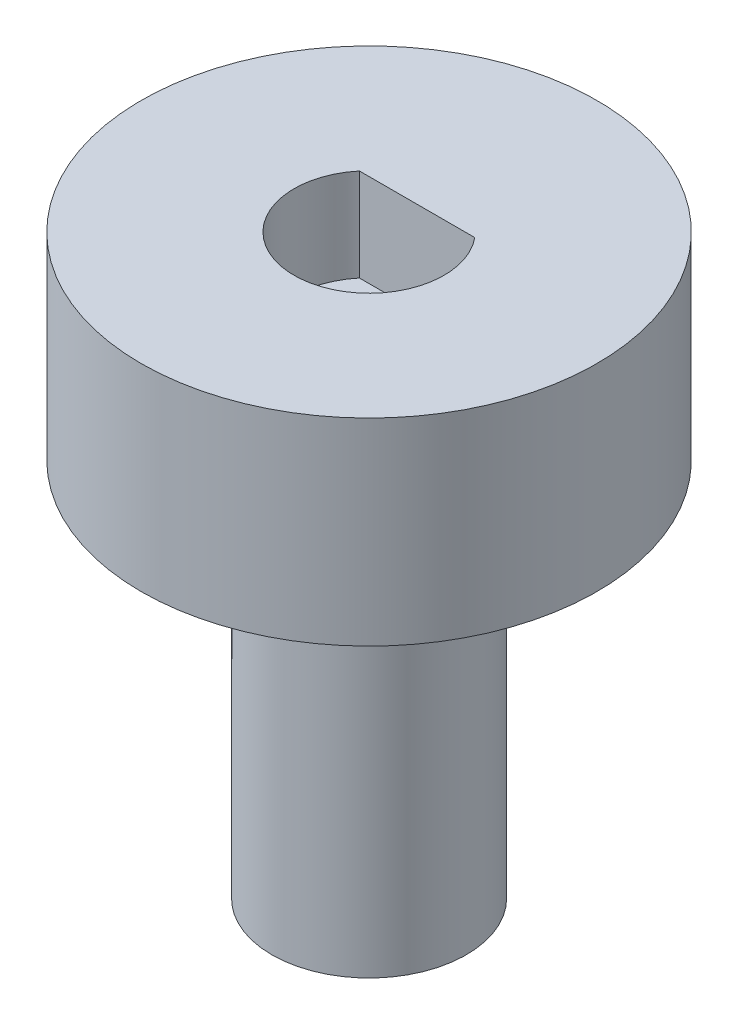
ISO-10303-21;
HEADER;
FILE_DESCRIPTION(('STEP AP214'),'2;1');
FILE_NAME('part.step','',(''),(''),'','','');
FILE_SCHEMA(('AUTOMOTIVE_DESIGN { 1 0 10303 214 1 1 1 1 }'));
ENDSEC;
DATA;
#1=APPLICATION_CONTEXT('core data for automotive mechanical design processes');
#2=APPLICATION_PROTOCOL_DEFINITION('international standard','automotive_design',2000,#1);
#3=PRODUCT_CONTEXT('',#1,'mechanical');
#4=PRODUCT('Part','Part','',(#3));
#5=PRODUCT_RELATED_PRODUCT_CATEGORY('part','',(#4));
#6=PRODUCT_DEFINITION_FORMATION('','',#4);
#7=PRODUCT_DEFINITION_CONTEXT('part definition',#1,'design');
#8=PRODUCT_DEFINITION('design','',#6,#7);
#9=PRODUCT_DEFINITION_SHAPE('','',#8);
#10=(LENGTH_UNIT() NAMED_UNIT(*) SI_UNIT(.MILLI.,.METRE.));
#11=(NAMED_UNIT(*) PLANE_ANGLE_UNIT() SI_UNIT($,.RADIAN.));
#12=(NAMED_UNIT(*) SI_UNIT($,.STERADIAN.) SOLID_ANGLE_UNIT());
#13=UNCERTAINTY_MEASURE_WITH_UNIT(LENGTH_MEASURE(1.E-05),#10,'distance_accuracy_value','');
#14=(GEOMETRIC_REPRESENTATION_CONTEXT(3) GLOBAL_UNCERTAINTY_ASSIGNED_CONTEXT((#13)) GLOBAL_UNIT_ASSIGNED_CONTEXT((#10,
#11,#12)) REPRESENTATION_CONTEXT('',''));
#15=CARTESIAN_POINT('',(0.,0.,0.));
#16=DIRECTION('',(0.,0.,1.));
#17=DIRECTION('',(1.,0.,0.));
#18=AXIS2_PLACEMENT_3D('',#15,#16,#17);
#19=CARTESIAN_POINT('',(0.,15.875,0.));
#20=DIRECTION('',(0.,-1.,0.));
#21=DIRECTION('',(0.,0.,-1.));
#22=AXIS2_PLACEMENT_3D('',#19,#20,#21);
#23=CYLINDRICAL_SURFACE('',#22,4.066);
#24=CARTESIAN_POINT('',(0.,15.875,0.));
#25=DIRECTION('',(0.,1.,0.));
#26=DIRECTION('',(0.,0.,1.));
#27=AXIS2_PLACEMENT_3D('',#24,#25,#26);
#28=CIRCLE('',#27,4.066);
#29=CARTESIAN_POINT('',(0.,15.875,4.066));
#30=VERTEX_POINT('',#29);
#31=EDGE_CURVE('E11',#30,#30,#28,.T.);
#32=ORIENTED_EDGE('',*,*,#31,.F.);
#33=EDGE_LOOP('',(#32));
#34=FACE_BOUND('',#33,.T.);
#35=CARTESIAN_POINT('',(0.,0.,0.));
#36=DIRECTION('',(0.,1.,0.));
#37=DIRECTION('',(0.,0.,1.));
#38=AXIS2_PLACEMENT_3D('',#35,#36,#37);
#39=CIRCLE('',#38,4.066);
#40=CARTESIAN_POINT('',(0.,0.,4.066));
#41=VERTEX_POINT('',#40);
#42=EDGE_CURVE('E38',#41,#41,#39,.T.);
#43=ORIENTED_EDGE('',*,*,#42,.T.);
#44=EDGE_LOOP('',(#43));
#45=FACE_BOUND('',#44,.T.);
#46=ADVANCED_FACE('F35',(#34,#45),#23,.T.);
#47=CARTESIAN_POINT('',(0.,0.,0.));
#48=DIRECTION('',(0.,1.,0.));
#49=DIRECTION('',(0.,0.,1.));
#50=AXIS2_PLACEMENT_3D('',#47,#48,#49);
#51=PLANE('',#50);
#52=ORIENTED_EDGE('',*,*,#42,.F.);
#53=EDGE_LOOP('',(#52));
#54=FACE_BOUND('',#53,.T.);
#55=ADVANCED_FACE('F101',(#54),#51,.F.);
#56=CARTESIAN_POINT('',(0.,24.13,0.));
#57=DIRECTION('',(0.,-1.,0.));
#58=DIRECTION('',(0.,0.,-1.));
#59=AXIS2_PLACEMENT_3D('',#56,#57,#58);
#60=CYLINDRICAL_SURFACE('',#59,9.525);
#61=CARTESIAN_POINT('',(0.,24.13,0.));
#62=DIRECTION('',(0.,1.,0.));
#63=DIRECTION('',(0.,0.,1.));
#64=AXIS2_PLACEMENT_3D('',#61,#62,#63);
#65=CIRCLE('',#64,9.525);
#66=CARTESIAN_POINT('',(0.,24.13,9.525));
#67=VERTEX_POINT('',#66);
#68=EDGE_CURVE('E81',#67,#67,#65,.T.);
#69=ORIENTED_EDGE('',*,*,#68,.F.);
#70=EDGE_LOOP('',(#69));
#71=FACE_BOUND('',#70,.T.);
#72=CARTESIAN_POINT('',(0.,15.875,0.));
#73=DIRECTION('',(0.,1.,0.));
#74=DIRECTION('',(0.,0.,1.));
#75=AXIS2_PLACEMENT_3D('',#72,#73,#74);
#76=CIRCLE('',#75,9.525);
#77=CARTESIAN_POINT('',(0.,15.875,9.525));
#78=VERTEX_POINT('',#77);
#79=EDGE_CURVE('E65',#78,#78,#76,.T.);
#80=ORIENTED_EDGE('',*,*,#79,.T.);
#81=EDGE_LOOP('',(#80));
#82=FACE_BOUND('',#81,.T.);
#83=ADVANCED_FACE('F87',(#71,#82),#60,.T.);
#84=CARTESIAN_POINT('',(0.,24.13,0.));
#85=DIRECTION('',(0.,1.,0.));
#86=DIRECTION('',(0.,0.,1.));
#87=AXIS2_PLACEMENT_3D('',#84,#85,#86);
#88=PLANE('',#87);
#89=CARTESIAN_POINT('',(0.,24.13,0.));
#90=DIRECTION('',(0.,1.,0.));
#91=DIRECTION('',(0.,0.,1.));
#92=AXIS2_PLACEMENT_3D('',#89,#90,#91);
#93=CIRCLE('',#92,3.1369);
#94=CARTESIAN_POINT('',(-2.41031525044837,24.13,-2.007616));
#95=VERTEX_POINT('',#94);
#96=CARTESIAN_POINT('',(2.41031525044837,24.13,-2.007616));
#97=VERTEX_POINT('',#96);
#98=EDGE_CURVE('E49',#95,#97,#93,.T.);
#99=ORIENTED_EDGE('',*,*,#98,.F.);
#100=DIRECTION('',(-1.,0.,0.));
#101=VECTOR('',#100,1.);
#102=CARTESIAN_POINT('',(-2.41031525044837,24.13,-2.007616));
#103=LINE('',#102,#101);
#104=EDGE_CURVE('E69',#97,#95,#103,.T.);
#105=ORIENTED_EDGE('',*,*,#104,.F.);
#106=EDGE_LOOP('',(#99,#105));
#107=FACE_BOUND('',#106,.T.);
#108=ORIENTED_EDGE('',*,*,#68,.T.);
#109=EDGE_LOOP('',(#108));
#110=FACE_BOUND('',#109,.T.);
#111=ADVANCED_FACE('F73',(#107,#110),#88,.T.);
#112=CARTESIAN_POINT('',(0.,15.875,0.));
#113=DIRECTION('',(0.,1.,0.));
#114=DIRECTION('',(0.,0.,1.));
#115=AXIS2_PLACEMENT_3D('',#112,#113,#114);
#116=PLANE('',#115);
#117=ORIENTED_EDGE('',*,*,#31,.T.);
#118=EDGE_LOOP('',(#117));
#119=FACE_BOUND('',#118,.T.);
#120=ORIENTED_EDGE('',*,*,#79,.F.);
#121=EDGE_LOOP('',(#120));
#122=FACE_BOUND('',#121,.T.);
#123=ADVANCED_FACE('F89',(#119,#122),#116,.F.);
#124=CARTESIAN_POINT('',(0.,20.255,0.));
#125=DIRECTION('',(0.,1.,0.));
#126=DIRECTION('',(0.,0.,1.));
#127=AXIS2_PLACEMENT_3D('',#124,#125,#126);
#128=CYLINDRICAL_SURFACE('',#127,3.1369);
#129=ORIENTED_EDGE('',*,*,#98,.T.);
#130=DIRECTION('',(0.,1.,0.));
#131=VECTOR('',#130,1.);
#132=CARTESIAN_POINT('',(2.41031525044837,20.255,-2.007616));
#133=LINE('',#132,#131);
#134=CARTESIAN_POINT('',(2.41031525044837,20.255,-2.007616));
#135=VERTEX_POINT('',#134);
#136=EDGE_CURVE('E66',#135,#97,#133,.T.);
#137=ORIENTED_EDGE('',*,*,#136,.F.);
#138=CARTESIAN_POINT('',(0.,20.255,0.));
#139=DIRECTION('',(0.,1.,0.));
#140=DIRECTION('',(0.,0.,1.));
#141=AXIS2_PLACEMENT_3D('',#138,#139,#140);
#142=CIRCLE('',#141,3.1369);
#143=CARTESIAN_POINT('',(-2.41031525044837,20.255,-2.007616));
#144=VERTEX_POINT('',#143);
#145=EDGE_CURVE('E63',#144,#135,#142,.T.);
#146=ORIENTED_EDGE('',*,*,#145,.F.);
#147=DIRECTION('',(0.,1.,0.));
#148=VECTOR('',#147,1.);
#149=CARTESIAN_POINT('',(-2.41031525044837,20.255,-2.007616));
#150=LINE('',#149,#148);
#151=EDGE_CURVE('E57',#144,#95,#150,.T.);
#152=ORIENTED_EDGE('',*,*,#151,.T.);
#153=EDGE_LOOP('',(#129,#137,#146,#152));
#154=FACE_BOUND('',#153,.T.);
#155=ADVANCED_FACE('F61',(#154),#128,.F.);
#156=CARTESIAN_POINT('',(-2.41031525044837,20.255,-2.007616));
#157=DIRECTION('',(0.,0.,-1.));
#158=DIRECTION('',(-1.,0.,0.));
#159=AXIS2_PLACEMENT_3D('',#156,#157,#158);
#160=PLANE('',#159);
#161=ORIENTED_EDGE('',*,*,#104,.T.);
#162=ORIENTED_EDGE('',*,*,#151,.F.);
#163=DIRECTION('',(-1.,0.,0.));
#164=VECTOR('',#163,1.);
#165=CARTESIAN_POINT('',(-2.41031525044837,20.255,-2.007616));
#166=LINE('',#165,#164);
#167=EDGE_CURVE('E77',#135,#144,#166,.T.);
#168=ORIENTED_EDGE('',*,*,#167,.F.);
#169=ORIENTED_EDGE('',*,*,#136,.T.);
#170=EDGE_LOOP('',(#161,#162,#168,#169));
#171=FACE_BOUND('',#170,.T.);
#172=ADVANCED_FACE('F70',(#171),#160,.F.);
#173=CARTESIAN_POINT('',(0.,20.255,0.));
#174=DIRECTION('',(0.,1.,0.));
#175=DIRECTION('',(0.,0.,1.));
#176=AXIS2_PLACEMENT_3D('',#173,#174,#175);
#177=PLANE('',#176);
#178=ORIENTED_EDGE('',*,*,#145,.T.);
#179=ORIENTED_EDGE('',*,*,#167,.T.);
#180=EDGE_LOOP('',(#178,#179));
#181=FACE_BOUND('',#180,.T.);
#182=ADVANCED_FACE('F139',(#181),#177,.T.);
#183=CLOSED_SHELL('',(#46,#55,#83,#111,#123,#155,#172,#182));
#184=MANIFOLD_SOLID_BREP('B2',#183);
#185=ADVANCED_BREP_SHAPE_REPRESENTATION('',(#18,#184),#14);
#186=SHAPE_DEFINITION_REPRESENTATION(#9,#185);
ENDSEC;
END-ISO-10303-21;
